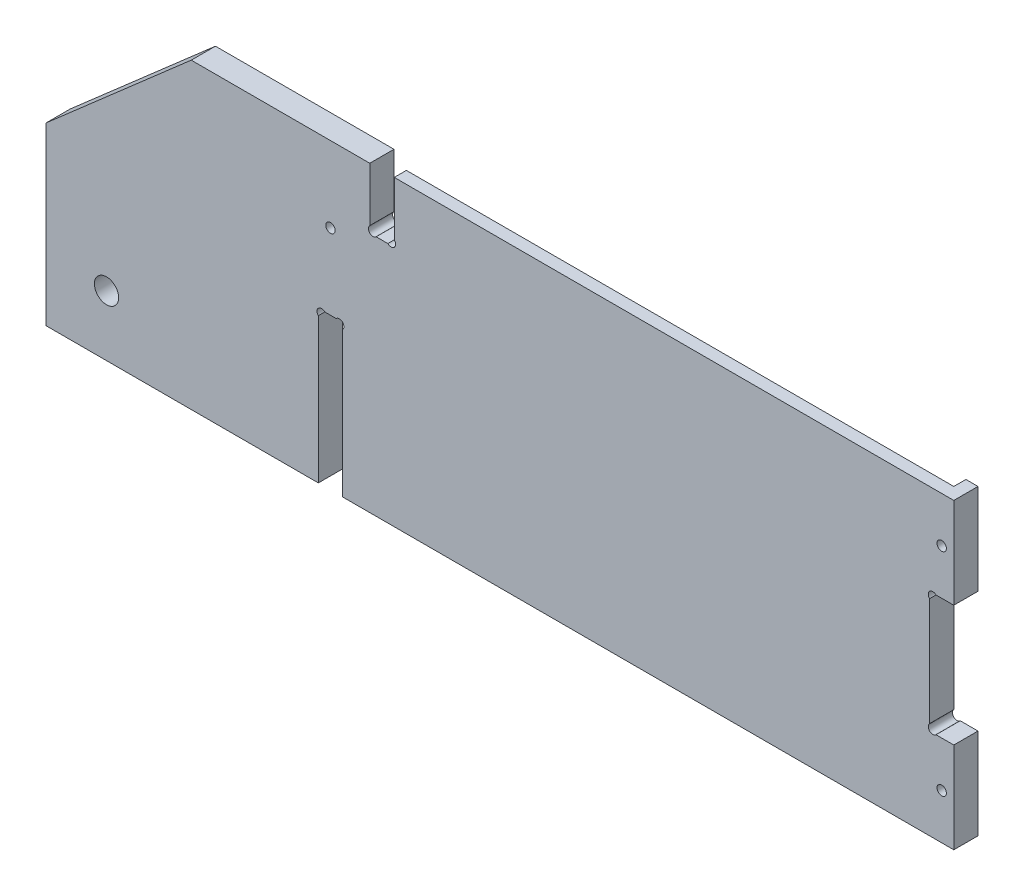
ISO-10303-21;
HEADER;
FILE_DESCRIPTION(('STEP AP214'),'2;1');
FILE_NAME('part.step','',(''),(''),'','','');
FILE_SCHEMA(('AUTOMOTIVE_DESIGN { 1 0 10303 214 1 1 1 1 }'));
ENDSEC;
DATA;
#1=APPLICATION_CONTEXT('core data for automotive mechanical design processes');
#2=APPLICATION_PROTOCOL_DEFINITION('international standard','automotive_design',2000,#1);
#3=PRODUCT_CONTEXT('',#1,'mechanical');
#4=PRODUCT('Part','Part','',(#3));
#5=PRODUCT_RELATED_PRODUCT_CATEGORY('part','',(#4));
#6=PRODUCT_DEFINITION_FORMATION('','',#4);
#7=PRODUCT_DEFINITION_CONTEXT('part definition',#1,'design');
#8=PRODUCT_DEFINITION('design','',#6,#7);
#9=PRODUCT_DEFINITION_SHAPE('','',#8);
#10=(LENGTH_UNIT() NAMED_UNIT(*) SI_UNIT(.MILLI.,.METRE.));
#11=(NAMED_UNIT(*) PLANE_ANGLE_UNIT() SI_UNIT($,.RADIAN.));
#12=(NAMED_UNIT(*) SI_UNIT($,.STERADIAN.) SOLID_ANGLE_UNIT());
#13=UNCERTAINTY_MEASURE_WITH_UNIT(LENGTH_MEASURE(1.E-05),#10,'distance_accuracy_value','');
#14=(GEOMETRIC_REPRESENTATION_CONTEXT(3) GLOBAL_UNCERTAINTY_ASSIGNED_CONTEXT((#13)) GLOBAL_UNIT_ASSIGNED_CONTEXT((#10,
#11,#12)) REPRESENTATION_CONTEXT('',''));
#15=CARTESIAN_POINT('',(0.,0.,0.));
#16=DIRECTION('',(0.,0.,1.));
#17=DIRECTION('',(1.,0.,0.));
#18=AXIS2_PLACEMENT_3D('',#15,#16,#17);
#19=CARTESIAN_POINT('',(46.9050399967534,13.4203251605363,8.));
#20=DIRECTION('',(0.,0.,1.));
#21=DIRECTION('',(1.,0.,0.));
#22=AXIS2_PLACEMENT_3D('',#19,#20,#21);
#23=PLANE('',#22);
#24=CARTESIAN_POINT('',(-30.0342998314668,-15.5190146676839,8.));
#25=DIRECTION('',(0.,0.,1.));
#26=DIRECTION('',(1.,0.,0.));
#27=AXIS2_PLACEMENT_3D('',#24,#25,#26);
#28=CIRCLE('',#27,4.);
#29=CARTESIAN_POINT('',(-26.0342998314668,-15.5190146676839,8.));
#30=VERTEX_POINT('',#29);
#31=EDGE_CURVE('E437',#30,#30,#28,.T.);
#32=ORIENTED_EDGE('',*,*,#31,.F.);
#33=EDGE_LOOP('',(#32));
#34=FACE_BOUND('',#33,.T.);
#35=CARTESIAN_POINT('',(245.965700168533,-20.5190146676839,8.));
#36=DIRECTION('',(0.,0.,1.));
#37=DIRECTION('',(1.,0.,0.));
#38=AXIS2_PLACEMENT_3D('',#35,#36,#37);
#39=CIRCLE('',#38,1.54999999999999);
#40=CARTESIAN_POINT('',(247.515700168533,-20.5190146676839,8.));
#41=VERTEX_POINT('',#40);
#42=EDGE_CURVE('E462',#41,#41,#39,.T.);
#43=ORIENTED_EDGE('',*,*,#42,.F.);
#44=EDGE_LOOP('',(#43));
#45=FACE_BOUND('',#44,.T.);
#46=DIRECTION('',(0.,1.,0.));
#47=VECTOR('',#46,1.);
#48=CARTESIAN_POINT('',(249.965700168533,-5.519014667684,8.));
#49=LINE('',#48,#47);
#50=CARTESIAN_POINT('',(249.965700168533,-35.5190146676839,8.));
#51=VERTEX_POINT('',#50);
#52=CARTESIAN_POINT('',(249.965700168533,-5.519014667684,8.));
#53=VERTEX_POINT('',#52);
#54=EDGE_CURVE('E275',#51,#53,#49,.T.);
#55=ORIENTED_EDGE('',*,*,#54,.T.);
#56=DIRECTION('',(-1.,0.,0.));
#57=VECTOR('',#56,1.);
#58=CARTESIAN_POINT('',(244.087020512093,-5.51901466768398,8.));
#59=LINE('',#58,#57);
#60=CARTESIAN_POINT('',(244.087020512093,-5.51901466768397,8.));
#61=VERTEX_POINT('',#60);
#62=EDGE_CURVE('E140',#53,#61,#59,.T.);
#63=ORIENTED_EDGE('',*,*,#62,.T.);
#64=CARTESIAN_POINT('',(243.026360340313,-4.45835449590417,8.));
#65=DIRECTION('',(0.,0.,-1.));
#66=DIRECTION('',(1.,0.,0.));
#67=AXIS2_PLACEMENT_3D('',#64,#65,#66);
#68=CIRCLE('',#67,1.50000000000001);
#69=CARTESIAN_POINT('',(241.965700168533,-3.39769432412416,8.));
#70=VERTEX_POINT('',#69);
#71=EDGE_CURVE('E403',#61,#70,#68,.T.);
#72=ORIENTED_EDGE('',*,*,#71,.T.);
#73=DIRECTION('',(0.,1.,0.));
#74=VECTOR('',#73,1.);
#75=CARTESIAN_POINT('',(241.965700168533,-3.39769432412416,8.));
#76=LINE('',#75,#74);
#77=CARTESIAN_POINT('',(241.965700168533,32.3596649887565,8.));
#78=VERTEX_POINT('',#77);
#79=EDGE_CURVE('E410',#70,#78,#76,.T.);
#80=ORIENTED_EDGE('',*,*,#79,.T.);
#81=CARTESIAN_POINT('',(243.026360340313,33.4203251605363,8.));
#82=DIRECTION('',(0.,0.,-1.));
#83=DIRECTION('',(1.,0.,0.));
#84=AXIS2_PLACEMENT_3D('',#81,#82,#83);
#85=CIRCLE('',#84,1.50000000000002);
#86=CARTESIAN_POINT('',(244.087020512093,34.4809853323162,8.));
#87=VERTEX_POINT('',#86);
#88=EDGE_CURVE('E412',#78,#87,#85,.T.);
#89=ORIENTED_EDGE('',*,*,#88,.T.);
#90=DIRECTION('',(1.,0.,0.));
#91=VECTOR('',#90,1.);
#92=CARTESIAN_POINT('',(244.087020512093,34.4809853323162,8.));
#93=LINE('',#92,#91);
#94=CARTESIAN_POINT('',(249.965700168533,34.4809853323162,8.));
#95=VERTEX_POINT('',#94);
#96=EDGE_CURVE('E414',#87,#95,#93,.T.);
#97=ORIENTED_EDGE('',*,*,#96,.T.);
#98=DIRECTION('',(0.,1.,0.));
#99=VECTOR('',#98,1.);
#100=CARTESIAN_POINT('',(249.965700168533,64.4809853323161,8.));
#101=LINE('',#100,#99);
#102=CARTESIAN_POINT('',(249.965700168533,64.4809853323161,8.));
#103=VERTEX_POINT('',#102);
#104=EDGE_CURVE('E363',#95,#103,#101,.T.);
#105=ORIENTED_EDGE('',*,*,#104,.T.);
#106=DIRECTION('',(-1.,0.,0.));
#107=VECTOR('',#106,1.);
#108=CARTESIAN_POINT('',(65.0567234642537,64.480985332316,8.));
#109=LINE('',#108,#107);
#110=CARTESIAN_POINT('',(65.0567234642537,64.480985332316,8.));
#111=VERTEX_POINT('',#110);
#112=EDGE_CURVE('E359',#103,#111,#109,.T.);
#113=ORIENTED_EDGE('',*,*,#112,.T.);
#114=DIRECTION('',(0.,-1.,0.));
#115=VECTOR('',#114,1.);
#116=CARTESIAN_POINT('',(65.0567234642537,46.6023056758756,8.));
#117=LINE('',#116,#115);
#118=CARTESIAN_POINT('',(65.0567234642537,46.6023056758756,8.));
#119=VERTEX_POINT('',#118);
#120=EDGE_CURVE('E356',#111,#119,#117,.T.);
#121=ORIENTED_EDGE('',*,*,#120,.T.);
#122=CARTESIAN_POINT('',(63.9960632924738,45.5416455040958,8.));
#123=DIRECTION('',(0.,0.,-1.));
#124=DIRECTION('',(1.,0.,0.));
#125=AXIS2_PLACEMENT_3D('',#122,#123,#124);
#126=CIRCLE('',#125,1.49999999999999);
#127=CARTESIAN_POINT('',(62.935403120694,44.480985332316,8.));
#128=VERTEX_POINT('',#127);
#129=EDGE_CURVE('E358',#119,#128,#126,.T.);
#130=ORIENTED_EDGE('',*,*,#129,.T.);
#131=DIRECTION('',(-1.,0.,0.));
#132=VECTOR('',#131,1.);
#133=CARTESIAN_POINT('',(62.935403120694,44.480985332316,8.));
#134=LINE('',#133,#132);
#135=CARTESIAN_POINT('',(59.0630231311127,44.480985332316,8.));
#136=VERTEX_POINT('',#135);
#137=EDGE_CURVE('E361',#128,#136,#134,.T.);
#138=ORIENTED_EDGE('',*,*,#137,.T.);
#139=CARTESIAN_POINT('',(58.014361649823,45.5535099696364,8.));
#140=DIRECTION('',(0.,0.,-1.));
#141=DIRECTION('',(1.,0.,0.));
#142=AXIS2_PLACEMENT_3D('',#139,#140,#141);
#143=CIRCLE('',#142,1.49999999999998);
#144=CARTESIAN_POINT('',(56.9657001685331,46.6260346069567,8.));
#145=VERTEX_POINT('',#144);
#146=EDGE_CURVE('E368',#136,#145,#143,.T.);
#147=ORIENTED_EDGE('',*,*,#146,.T.);
#148=DIRECTION('',(0.,1.,0.));
#149=VECTOR('',#148,1.);
#150=CARTESIAN_POINT('',(56.9657001685332,64.480985332316,8.));
#151=LINE('',#150,#149);
#152=CARTESIAN_POINT('',(56.9657001685332,64.480985332316,8.));
#153=VERTEX_POINT('',#152);
#154=EDGE_CURVE('E370',#145,#153,#151,.T.);
#155=ORIENTED_EDGE('',*,*,#154,.T.);
#156=DIRECTION('',(-1.,0.,0.));
#157=VECTOR('',#156,1.);
#158=CARTESIAN_POINT('',(-2.03429983146681,64.480985332316,8.));
#159=LINE('',#158,#157);
#160=CARTESIAN_POINT('',(-2.03429983146681,64.480985332316,8.));
#161=VERTEX_POINT('',#160);
#162=EDGE_CURVE('E372',#153,#161,#159,.T.);
#163=ORIENTED_EDGE('',*,*,#162,.T.);
#164=DIRECTION('',(-0.752824501912083,-0.658221292059763,0.));
#165=VECTOR('',#164,1.);
#166=CARTESIAN_POINT('',(-50.0342998314669,22.5128746523074,8.));
#167=LINE('',#166,#165);
#168=CARTESIAN_POINT('',(-50.0342998314669,22.5128746523074,8.));
#169=VERTEX_POINT('',#168);
#170=EDGE_CURVE('E374',#161,#169,#167,.T.);
#171=ORIENTED_EDGE('',*,*,#170,.T.);
#172=DIRECTION('',(0.,-1.,0.));
#173=VECTOR('',#172,1.);
#174=CARTESIAN_POINT('',(-50.0342998314669,22.5128746523074,8.));
#175=LINE('',#174,#173);
#176=CARTESIAN_POINT('',(-50.0342998314668,-35.5190146676839,8.));
#177=VERTEX_POINT('',#176);
#178=EDGE_CURVE('E376',#169,#177,#175,.T.);
#179=ORIENTED_EDGE('',*,*,#178,.T.);
#180=DIRECTION('',(1.,0.,0.));
#181=VECTOR('',#180,1.);
#182=CARTESIAN_POINT('',(-50.0342998314668,-35.5190146676839,8.));
#183=LINE('',#182,#181);
#184=CARTESIAN_POINT('',(39.9657001685332,-35.5190146676839,8.));
#185=VERTEX_POINT('',#184);
#186=EDGE_CURVE('E378',#177,#185,#183,.T.);
#187=ORIENTED_EDGE('',*,*,#186,.T.);
#188=DIRECTION('',(0.,1.,0.));
#189=VECTOR('',#188,1.);
#190=CARTESIAN_POINT('',(39.9657001685332,-35.5190146676839,8.));
#191=LINE('',#190,#189);
#192=CARTESIAN_POINT('',(39.9657001685332,12.3596649887565,8.));
#193=VERTEX_POINT('',#192);
#194=EDGE_CURVE('E380',#185,#193,#191,.T.);
#195=ORIENTED_EDGE('',*,*,#194,.T.);
#196=CARTESIAN_POINT('',(41.0263603403129,13.4203251605363,8.));
#197=DIRECTION('',(0.,0.,-1.));
#198=DIRECTION('',(1.,0.,0.));
#199=AXIS2_PLACEMENT_3D('',#196,#197,#198);
#200=CIRCLE('',#199,1.5);
#201=CARTESIAN_POINT('',(42.0870205120928,14.4809853323161,8.));
#202=VERTEX_POINT('',#201);
#203=EDGE_CURVE('E382',#193,#202,#200,.T.);
#204=ORIENTED_EDGE('',*,*,#203,.T.);
#205=DIRECTION('',(1.,0.,0.));
#206=VECTOR('',#205,1.);
#207=CARTESIAN_POINT('',(42.0870205120928,14.4809853323161,8.));
#208=LINE('',#207,#206);
#209=CARTESIAN_POINT('',(45.8443798249735,14.4809853323161,8.));
#210=VERTEX_POINT('',#209);
#211=EDGE_CURVE('E207',#202,#210,#208,.T.);
#212=ORIENTED_EDGE('',*,*,#211,.T.);
#213=CARTESIAN_POINT('',(46.9050399967534,13.4203251605363,8.));
#214=DIRECTION('',(0.,0.,-1.));
#215=DIRECTION('',(1.,0.,0.));
#216=AXIS2_PLACEMENT_3D('',#213,#214,#215);
#217=CIRCLE('',#216,1.50000000000001);
#218=CARTESIAN_POINT('',(47.9657001685333,12.3596649887566,8.));
#219=VERTEX_POINT('',#218);
#220=EDGE_CURVE('E200',#210,#219,#217,.T.);
#221=ORIENTED_EDGE('',*,*,#220,.T.);
#222=DIRECTION('',(0.,-1.,0.));
#223=VECTOR('',#222,1.);
#224=CARTESIAN_POINT('',(47.9657001685333,-35.5190146676839,8.));
#225=LINE('',#224,#223);
#226=CARTESIAN_POINT('',(47.9657001685333,-35.5190146676839,8.));
#227=VERTEX_POINT('',#226);
#228=EDGE_CURVE('E204',#219,#227,#225,.T.);
#229=ORIENTED_EDGE('',*,*,#228,.T.);
#230=DIRECTION('',(1.,0.,0.));
#231=VECTOR('',#230,1.);
#232=CARTESIAN_POINT('',(47.9657001685333,-35.5190146676839,8.));
#233=LINE('',#232,#231);
#234=EDGE_CURVE('E56',#227,#51,#233,.T.);
#235=ORIENTED_EDGE('',*,*,#234,.T.);
#236=EDGE_LOOP('',(#55,#63,#72,#80,#89,#97,#105,#113,#121,#130,#138,#147,#155,#163,#171,#179,
#187,#195,#204,#212,#221,#229,#235));
#237=FACE_BOUND('',#236,.T.);
#238=CARTESIAN_POINT('',(245.965700168533,49.4809853323161,8.));
#239=DIRECTION('',(0.,0.,1.));
#240=DIRECTION('',(1.,0.,0.));
#241=AXIS2_PLACEMENT_3D('',#238,#239,#240);
#242=CIRCLE('',#241,1.54999999999999);
#243=CARTESIAN_POINT('',(247.515700168533,49.4809853323161,8.));
#244=VERTEX_POINT('',#243);
#245=EDGE_CURVE('E232',#244,#244,#242,.T.);
#246=ORIENTED_EDGE('',*,*,#245,.F.);
#247=EDGE_LOOP('',(#246));
#248=FACE_BOUND('',#247,.T.);
#249=CARTESIAN_POINT('',(43.9657001685332,39.4809853323161,8.));
#250=DIRECTION('',(0.,0.,1.));
#251=DIRECTION('',(1.,0.,0.));
#252=AXIS2_PLACEMENT_3D('',#249,#250,#251);
#253=CIRCLE('',#252,1.55);
#254=CARTESIAN_POINT('',(45.5157001685332,39.4809853323161,8.));
#255=VERTEX_POINT('',#254);
#256=EDGE_CURVE('E456',#255,#255,#253,.T.);
#257=ORIENTED_EDGE('',*,*,#256,.F.);
#258=EDGE_LOOP('',(#257));
#259=FACE_BOUND('',#258,.T.);
#260=ADVANCED_FACE('F32',(#34,#45,#237,#248,#259),#23,.T.);
#261=CARTESIAN_POINT('',(46.9050399967534,13.4203251605363,0.));
#262=DIRECTION('',(0.,0.,1.));
#263=DIRECTION('',(1.,0.,0.));
#264=AXIS2_PLACEMENT_3D('',#261,#262,#263);
#265=PLANE('',#264);
#266=CARTESIAN_POINT('',(-30.0342998314668,-15.5190146676839,0.));
#267=DIRECTION('',(0.,0.,-1.));
#268=DIRECTION('',(-1.,0.,0.));
#269=AXIS2_PLACEMENT_3D('',#266,#267,#268);
#270=CIRCLE('',#269,4.);
#271=CARTESIAN_POINT('',(-34.0342998314669,-15.5190146676839,0.));
#272=VERTEX_POINT('',#271);
#273=EDGE_CURVE('E442',#272,#272,#270,.T.);
#274=ORIENTED_EDGE('',*,*,#273,.F.);
#275=EDGE_LOOP('',(#274));
#276=FACE_BOUND('',#275,.T.);
#277=CARTESIAN_POINT('',(245.965700168533,-20.5190146676839,0.));
#278=DIRECTION('',(0.,0.,1.));
#279=DIRECTION('',(1.,0.,0.));
#280=AXIS2_PLACEMENT_3D('',#277,#278,#279);
#281=CIRCLE('',#280,1.54999999999999);
#282=CARTESIAN_POINT('',(247.515700168533,-20.5190146676839,0.));
#283=VERTEX_POINT('',#282);
#284=EDGE_CURVE('E459',#283,#283,#281,.T.);
#285=ORIENTED_EDGE('',*,*,#284,.T.);
#286=EDGE_LOOP('',(#285));
#287=FACE_BOUND('',#286,.T.);
#288=CARTESIAN_POINT('',(244.905039996753,53.5416455040959,0.));
#289=DIRECTION('',(0.,0.,-1.));
#290=DIRECTION('',(-1.,0.,0.));
#291=AXIS2_PLACEMENT_3D('',#288,#289,#290);
#292=CIRCLE('',#291,1.5);
#293=CARTESIAN_POINT('',(245.965700168533,54.6023056758757,0.));
#294=VERTEX_POINT('',#293);
#295=CARTESIAN_POINT('',(243.844379824974,52.480985332316,0.));
#296=VERTEX_POINT('',#295);
#297=EDGE_CURVE('E431',#294,#296,#292,.T.);
#298=ORIENTED_EDGE('',*,*,#297,.F.);
#299=DIRECTION('',(0.,-1.,0.));
#300=VECTOR('',#299,1.);
#301=CARTESIAN_POINT('',(245.965700168533,64.480985332316,0.));
#302=LINE('',#301,#300);
#303=CARTESIAN_POINT('',(245.965700168533,64.480985332316,0.));
#304=VERTEX_POINT('',#303);
#305=EDGE_CURVE('E427',#304,#294,#302,.T.);
#306=ORIENTED_EDGE('',*,*,#305,.F.);
#307=DIRECTION('',(-1.,0.,0.));
#308=VECTOR('',#307,1.);
#309=CARTESIAN_POINT('',(65.0567234642537,64.480985332316,0.));
#310=LINE('',#309,#308);
#311=CARTESIAN_POINT('',(249.965700168533,64.4809853323161,0.));
#312=VERTEX_POINT('',#311);
#313=EDGE_CURVE('E244',#312,#304,#310,.T.);
#314=ORIENTED_EDGE('',*,*,#313,.F.);
#315=DIRECTION('',(0.,1.,0.));
#316=VECTOR('',#315,1.);
#317=CARTESIAN_POINT('',(249.965700168533,64.4809853323161,0.));
#318=LINE('',#317,#316);
#319=CARTESIAN_POINT('',(249.965700168533,34.4809853323162,0.));
#320=VERTEX_POINT('',#319);
#321=EDGE_CURVE('E242',#320,#312,#318,.T.);
#322=ORIENTED_EDGE('',*,*,#321,.F.);
#323=DIRECTION('',(1.,0.,0.));
#324=VECTOR('',#323,1.);
#325=CARTESIAN_POINT('',(244.087020512093,34.4809853323162,0.));
#326=LINE('',#325,#324);
#327=CARTESIAN_POINT('',(244.087020512093,34.4809853323162,0.));
#328=VERTEX_POINT('',#327);
#329=EDGE_CURVE('E240',#328,#320,#326,.T.);
#330=ORIENTED_EDGE('',*,*,#329,.F.);
#331=CARTESIAN_POINT('',(243.026360340313,33.4203251605363,0.));
#332=DIRECTION('',(0.,0.,-1.));
#333=DIRECTION('',(1.,0.,0.));
#334=AXIS2_PLACEMENT_3D('',#331,#332,#333);
#335=CIRCLE('',#334,1.50000000000002);
#336=CARTESIAN_POINT('',(241.965700168533,32.3596649887565,0.));
#337=VERTEX_POINT('',#336);
#338=EDGE_CURVE('E238',#337,#328,#335,.T.);
#339=ORIENTED_EDGE('',*,*,#338,.F.);
#340=DIRECTION('',(0.,1.,0.));
#341=VECTOR('',#340,1.);
#342=CARTESIAN_POINT('',(241.965700168533,-3.39769432412416,0.));
#343=LINE('',#342,#341);
#344=CARTESIAN_POINT('',(241.965700168533,-3.39769432412416,0.));
#345=VERTEX_POINT('',#344);
#346=EDGE_CURVE('E236',#345,#337,#343,.T.);
#347=ORIENTED_EDGE('',*,*,#346,.F.);
#348=CARTESIAN_POINT('',(243.026360340313,-4.45835449590417,0.));
#349=DIRECTION('',(0.,0.,-1.));
#350=DIRECTION('',(1.,0.,0.));
#351=AXIS2_PLACEMENT_3D('',#348,#349,#350);
#352=CIRCLE('',#351,1.50000000000001);
#353=CARTESIAN_POINT('',(244.087020512093,-5.51901466768397,0.));
#354=VERTEX_POINT('',#353);
#355=EDGE_CURVE('E234',#354,#345,#352,.T.);
#356=ORIENTED_EDGE('',*,*,#355,.F.);
#357=DIRECTION('',(-1.,0.,0.));
#358=VECTOR('',#357,1.);
#359=CARTESIAN_POINT('',(244.087020512093,-5.51901466768398,0.));
#360=LINE('',#359,#358);
#361=CARTESIAN_POINT('',(249.965700168533,-5.519014667684,0.));
#362=VERTEX_POINT('',#361);
#363=EDGE_CURVE('E231',#362,#354,#360,.T.);
#364=ORIENTED_EDGE('',*,*,#363,.F.);
#365=DIRECTION('',(0.,1.,0.));
#366=VECTOR('',#365,1.);
#367=CARTESIAN_POINT('',(249.965700168533,-5.519014667684,0.));
#368=LINE('',#367,#366);
#369=CARTESIAN_POINT('',(249.965700168533,-35.5190146676839,0.));
#370=VERTEX_POINT('',#369);
#371=EDGE_CURVE('E228',#370,#362,#368,.T.);
#372=ORIENTED_EDGE('',*,*,#371,.F.);
#373=DIRECTION('',(1.,0.,0.));
#374=VECTOR('',#373,1.);
#375=CARTESIAN_POINT('',(47.9657001685333,-35.5190146676839,0.));
#376=LINE('',#375,#374);
#377=CARTESIAN_POINT('',(47.9657001685333,-35.5190146676839,0.));
#378=VERTEX_POINT('',#377);
#379=EDGE_CURVE('E131',#378,#370,#376,.T.);
#380=ORIENTED_EDGE('',*,*,#379,.F.);
#381=DIRECTION('',(0.,-1.,0.));
#382=VECTOR('',#381,1.);
#383=CARTESIAN_POINT('',(47.9657001685333,-35.5190146676839,0.));
#384=LINE('',#383,#382);
#385=CARTESIAN_POINT('',(47.9657001685333,12.3596649887566,0.));
#386=VERTEX_POINT('',#385);
#387=EDGE_CURVE('E272',#386,#378,#384,.T.);
#388=ORIENTED_EDGE('',*,*,#387,.F.);
#389=CARTESIAN_POINT('',(46.9050399967534,13.4203251605363,0.));
#390=DIRECTION('',(0.,0.,-1.));
#391=DIRECTION('',(1.,0.,0.));
#392=AXIS2_PLACEMENT_3D('',#389,#390,#391);
#393=CIRCLE('',#392,1.50000000000001);
#394=CARTESIAN_POINT('',(45.8443798249735,14.4809853323161,0.));
#395=VERTEX_POINT('',#394);
#396=EDGE_CURVE('E216',#395,#386,#393,.T.);
#397=ORIENTED_EDGE('',*,*,#396,.F.);
#398=DIRECTION('',(1.,0.,0.));
#399=VECTOR('',#398,1.);
#400=CARTESIAN_POINT('',(42.0870205120928,14.4809853323161,0.));
#401=LINE('',#400,#399);
#402=CARTESIAN_POINT('',(42.0870205120928,14.4809853323161,0.));
#403=VERTEX_POINT('',#402);
#404=EDGE_CURVE('E269',#403,#395,#401,.T.);
#405=ORIENTED_EDGE('',*,*,#404,.F.);
#406=CARTESIAN_POINT('',(41.0263603403129,13.4203251605363,0.));
#407=DIRECTION('',(0.,0.,-1.));
#408=DIRECTION('',(1.,0.,0.));
#409=AXIS2_PLACEMENT_3D('',#406,#407,#408);
#410=CIRCLE('',#409,1.5);
#411=CARTESIAN_POINT('',(39.9657001685332,12.3596649887565,0.));
#412=VERTEX_POINT('',#411);
#413=EDGE_CURVE('E267',#412,#403,#410,.T.);
#414=ORIENTED_EDGE('',*,*,#413,.F.);
#415=DIRECTION('',(0.,1.,0.));
#416=VECTOR('',#415,1.);
#417=CARTESIAN_POINT('',(39.9657001685332,-35.5190146676839,0.));
#418=LINE('',#417,#416);
#419=CARTESIAN_POINT('',(39.9657001685332,-35.5190146676839,0.));
#420=VERTEX_POINT('',#419);
#421=EDGE_CURVE('E265',#420,#412,#418,.T.);
#422=ORIENTED_EDGE('',*,*,#421,.F.);
#423=DIRECTION('',(1.,0.,0.));
#424=VECTOR('',#423,1.);
#425=CARTESIAN_POINT('',(-50.0342998314668,-35.5190146676839,0.));
#426=LINE('',#425,#424);
#427=CARTESIAN_POINT('',(-50.0342998314668,-35.5190146676839,0.));
#428=VERTEX_POINT('',#427);
#429=EDGE_CURVE('E263',#428,#420,#426,.T.);
#430=ORIENTED_EDGE('',*,*,#429,.F.);
#431=DIRECTION('',(0.,-1.,0.));
#432=VECTOR('',#431,1.);
#433=CARTESIAN_POINT('',(-50.0342998314669,22.5128746523074,0.));
#434=LINE('',#433,#432);
#435=CARTESIAN_POINT('',(-50.0342998314669,22.5128746523074,0.));
#436=VERTEX_POINT('',#435);
#437=EDGE_CURVE('E261',#436,#428,#434,.T.);
#438=ORIENTED_EDGE('',*,*,#437,.F.);
#439=DIRECTION('',(-0.752824501912083,-0.658221292059763,0.));
#440=VECTOR('',#439,1.);
#441=CARTESIAN_POINT('',(-50.0342998314669,22.5128746523074,0.));
#442=LINE('',#441,#440);
#443=CARTESIAN_POINT('',(-2.03429983146681,64.480985332316,0.));
#444=VERTEX_POINT('',#443);
#445=EDGE_CURVE('E259',#444,#436,#442,.T.);
#446=ORIENTED_EDGE('',*,*,#445,.F.);
#447=DIRECTION('',(-1.,0.,0.));
#448=VECTOR('',#447,1.);
#449=CARTESIAN_POINT('',(-2.03429983146681,64.480985332316,0.));
#450=LINE('',#449,#448);
#451=CARTESIAN_POINT('',(56.9657001685332,64.480985332316,0.));
#452=VERTEX_POINT('',#451);
#453=EDGE_CURVE('E257',#452,#444,#450,.T.);
#454=ORIENTED_EDGE('',*,*,#453,.F.);
#455=DIRECTION('',(0.,1.,0.));
#456=VECTOR('',#455,1.);
#457=CARTESIAN_POINT('',(56.9657001685332,64.480985332316,0.));
#458=LINE('',#457,#456);
#459=CARTESIAN_POINT('',(56.9657001685331,46.6260346069567,0.));
#460=VERTEX_POINT('',#459);
#461=EDGE_CURVE('E255',#460,#452,#458,.T.);
#462=ORIENTED_EDGE('',*,*,#461,.F.);
#463=CARTESIAN_POINT('',(58.014361649823,45.5535099696364,0.));
#464=DIRECTION('',(0.,0.,-1.));
#465=DIRECTION('',(1.,0.,0.));
#466=AXIS2_PLACEMENT_3D('',#463,#464,#465);
#467=CIRCLE('',#466,1.49999999999998);
#468=CARTESIAN_POINT('',(59.0630231311127,44.480985332316,0.));
#469=VERTEX_POINT('',#468);
#470=EDGE_CURVE('E253',#469,#460,#467,.T.);
#471=ORIENTED_EDGE('',*,*,#470,.F.);
#472=DIRECTION('',(-1.,0.,0.));
#473=VECTOR('',#472,1.);
#474=CARTESIAN_POINT('',(62.935403120694,44.480985332316,0.));
#475=LINE('',#474,#473);
#476=CARTESIAN_POINT('',(62.935403120694,44.480985332316,0.));
#477=VERTEX_POINT('',#476);
#478=EDGE_CURVE('E251',#477,#469,#475,.T.);
#479=ORIENTED_EDGE('',*,*,#478,.F.);
#480=CARTESIAN_POINT('',(63.9960632924738,45.5416455040958,0.));
#481=DIRECTION('',(0.,0.,-1.));
#482=DIRECTION('',(1.,0.,0.));
#483=AXIS2_PLACEMENT_3D('',#480,#481,#482);
#484=CIRCLE('',#483,1.49999999999999);
#485=CARTESIAN_POINT('',(65.0567234642537,46.6023056758756,0.));
#486=VERTEX_POINT('',#485);
#487=EDGE_CURVE('E249',#486,#477,#484,.T.);
#488=ORIENTED_EDGE('',*,*,#487,.F.);
#489=DIRECTION('',(0.,-1.,0.));
#490=VECTOR('',#489,1.);
#491=CARTESIAN_POINT('',(65.0567234642537,46.6023056758756,0.));
#492=LINE('',#491,#490);
#493=CARTESIAN_POINT('',(65.0567234642537,52.480985332316,0.));
#494=VERTEX_POINT('',#493);
#495=EDGE_CURVE('E247',#494,#486,#492,.T.);
#496=ORIENTED_EDGE('',*,*,#495,.F.);
#497=DIRECTION('',(-1.,0.,0.));
#498=VECTOR('',#497,1.);
#499=CARTESIAN_POINT('',(243.844379824974,52.480985332316,0.));
#500=LINE('',#499,#498);
#501=EDGE_CURVE('E439',#296,#494,#500,.T.);
#502=ORIENTED_EDGE('',*,*,#501,.F.);
#503=EDGE_LOOP('',(#298,#306,#314,#322,#330,#339,#347,#356,#364,#372,#380,#388,#397,#405,#414,
#422,#430,#438,#446,#454,#462,#471,#479,#488,#496,#502));
#504=FACE_BOUND('',#503,.T.);
#505=CARTESIAN_POINT('',(245.965700168533,49.4809853323161,0.));
#506=DIRECTION('',(0.,0.,1.));
#507=DIRECTION('',(1.,0.,0.));
#508=AXIS2_PLACEMENT_3D('',#505,#506,#507);
#509=CIRCLE('',#508,1.54999999999999);
#510=CARTESIAN_POINT('',(247.515700168533,49.4809853323161,0.));
#511=VERTEX_POINT('',#510);
#512=EDGE_CURVE('E406',#511,#511,#509,.T.);
#513=ORIENTED_EDGE('',*,*,#512,.T.);
#514=EDGE_LOOP('',(#513));
#515=FACE_BOUND('',#514,.T.);
#516=CARTESIAN_POINT('',(43.9657001685332,39.4809853323161,0.));
#517=DIRECTION('',(0.,0.,1.));
#518=DIRECTION('',(1.,0.,0.));
#519=AXIS2_PLACEMENT_3D('',#516,#517,#518);
#520=CIRCLE('',#519,1.55);
#521=CARTESIAN_POINT('',(45.5157001685332,39.4809853323161,0.));
#522=VERTEX_POINT('',#521);
#523=EDGE_CURVE('E450',#522,#522,#520,.T.);
#524=ORIENTED_EDGE('',*,*,#523,.T.);
#525=EDGE_LOOP('',(#524));
#526=FACE_BOUND('',#525,.T.);
#527=ADVANCED_FACE('F395',(#276,#287,#504,#515,#526),#265,.F.);
#528=CARTESIAN_POINT('',(249.965700168533,-5.519014667684,8.));
#529=DIRECTION('',(-1.,0.,0.));
#530=DIRECTION('',(0.,-1.,0.));
#531=AXIS2_PLACEMENT_3D('',#528,#529,#530);
#532=PLANE('',#531);
#533=ORIENTED_EDGE('',*,*,#371,.T.);
#534=DIRECTION('',(0.,0.,-1.));
#535=VECTOR('',#534,1.);
#536=CARTESIAN_POINT('',(249.965700168533,-5.519014667684,8.));
#537=LINE('',#536,#535);
#538=EDGE_CURVE('E333',#53,#362,#537,.T.);
#539=ORIENTED_EDGE('',*,*,#538,.F.);
#540=ORIENTED_EDGE('',*,*,#54,.F.);
#541=DIRECTION('',(0.,0.,-1.));
#542=VECTOR('',#541,1.);
#543=CARTESIAN_POINT('',(249.965700168533,-35.5190146676839,8.));
#544=LINE('',#543,#542);
#545=EDGE_CURVE('E224',#51,#370,#544,.T.);
#546=ORIENTED_EDGE('',*,*,#545,.T.);
#547=EDGE_LOOP('',(#533,#539,#540,#546));
#548=FACE_BOUND('',#547,.T.);
#549=ADVANCED_FACE('F34',(#548),#532,.F.);
#550=CARTESIAN_POINT('',(244.087020512093,-5.51901466768398,8.));
#551=DIRECTION('',(0.,-1.,0.));
#552=DIRECTION('',(1.,0.,0.));
#553=AXIS2_PLACEMENT_3D('',#550,#551,#552);
#554=PLANE('',#553);
#555=ORIENTED_EDGE('',*,*,#363,.T.);
#556=DIRECTION('',(0.,0.,-1.));
#557=VECTOR('',#556,1.);
#558=CARTESIAN_POINT('',(244.087020512093,-5.51901466768397,8.));
#559=LINE('',#558,#557);
#560=EDGE_CURVE('E330',#61,#354,#559,.T.);
#561=ORIENTED_EDGE('',*,*,#560,.F.);
#562=ORIENTED_EDGE('',*,*,#62,.F.);
#563=ORIENTED_EDGE('',*,*,#538,.T.);
#564=EDGE_LOOP('',(#555,#561,#562,#563));
#565=FACE_BOUND('',#564,.T.);
#566=ADVANCED_FACE('F560',(#565),#554,.F.);
#567=CARTESIAN_POINT('',(243.026360340313,-4.45835449590417,8.));
#568=DIRECTION('',(0.,0.,-1.));
#569=DIRECTION('',(-1.,0.,0.));
#570=AXIS2_PLACEMENT_3D('',#567,#568,#569);
#571=CYLINDRICAL_SURFACE('',#570,1.50000000000001);
#572=ORIENTED_EDGE('',*,*,#355,.T.);
#573=DIRECTION('',(0.,0.,-1.));
#574=VECTOR('',#573,1.);
#575=CARTESIAN_POINT('',(241.965700168533,-3.39769432412416,8.));
#576=LINE('',#575,#574);
#577=EDGE_CURVE('E327',#70,#345,#576,.T.);
#578=ORIENTED_EDGE('',*,*,#577,.F.);
#579=ORIENTED_EDGE('',*,*,#71,.F.);
#580=ORIENTED_EDGE('',*,*,#560,.T.);
#581=EDGE_LOOP('',(#572,#578,#579,#580));
#582=FACE_BOUND('',#581,.T.);
#583=ADVANCED_FACE('F557',(#582),#571,.F.);
#584=CARTESIAN_POINT('',(241.965700168533,-3.39769432412416,8.));
#585=DIRECTION('',(-1.,0.,0.));
#586=DIRECTION('',(0.,0.,1.));
#587=AXIS2_PLACEMENT_3D('',#584,#585,#586);
#588=PLANE('',#587);
#589=ORIENTED_EDGE('',*,*,#346,.T.);
#590=DIRECTION('',(0.,0.,-1.));
#591=VECTOR('',#590,1.);
#592=CARTESIAN_POINT('',(241.965700168533,32.3596649887565,8.));
#593=LINE('',#592,#591);
#594=EDGE_CURVE('E324',#78,#337,#593,.T.);
#595=ORIENTED_EDGE('',*,*,#594,.F.);
#596=ORIENTED_EDGE('',*,*,#79,.F.);
#597=ORIENTED_EDGE('',*,*,#577,.T.);
#598=EDGE_LOOP('',(#589,#595,#596,#597));
#599=FACE_BOUND('',#598,.T.);
#600=ADVANCED_FACE('F553',(#599),#588,.F.);
#601=CARTESIAN_POINT('',(243.026360340313,33.4203251605363,8.));
#602=DIRECTION('',(0.,0.,-1.));
#603=DIRECTION('',(-1.,0.,0.));
#604=AXIS2_PLACEMENT_3D('',#601,#602,#603);
#605=CYLINDRICAL_SURFACE('',#604,1.50000000000002);
#606=ORIENTED_EDGE('',*,*,#338,.T.);
#607=DIRECTION('',(0.,0.,-1.));
#608=VECTOR('',#607,1.);
#609=CARTESIAN_POINT('',(244.087020512093,34.4809853323162,8.));
#610=LINE('',#609,#608);
#611=EDGE_CURVE('E321',#87,#328,#610,.T.);
#612=ORIENTED_EDGE('',*,*,#611,.F.);
#613=ORIENTED_EDGE('',*,*,#88,.F.);
#614=ORIENTED_EDGE('',*,*,#594,.T.);
#615=EDGE_LOOP('',(#606,#612,#613,#614));
#616=FACE_BOUND('',#615,.T.);
#617=ADVANCED_FACE('F549',(#616),#605,.F.);
#618=CARTESIAN_POINT('',(244.087020512093,34.4809853323162,8.));
#619=DIRECTION('',(0.,1.,0.));
#620=DIRECTION('',(0.,0.,1.));
#621=AXIS2_PLACEMENT_3D('',#618,#619,#620);
#622=PLANE('',#621);
#623=ORIENTED_EDGE('',*,*,#329,.T.);
#624=DIRECTION('',(0.,0.,-1.));
#625=VECTOR('',#624,1.);
#626=CARTESIAN_POINT('',(249.965700168533,34.4809853323162,8.));
#627=LINE('',#626,#625);
#628=EDGE_CURVE('E318',#95,#320,#627,.T.);
#629=ORIENTED_EDGE('',*,*,#628,.F.);
#630=ORIENTED_EDGE('',*,*,#96,.F.);
#631=ORIENTED_EDGE('',*,*,#611,.T.);
#632=EDGE_LOOP('',(#623,#629,#630,#631));
#633=FACE_BOUND('',#632,.T.);
#634=ADVANCED_FACE('F546',(#633),#622,.F.);
#635=CARTESIAN_POINT('',(249.965700168533,64.4809853323161,8.));
#636=DIRECTION('',(-1.,0.,0.));
#637=DIRECTION('',(0.,0.,1.));
#638=AXIS2_PLACEMENT_3D('',#635,#636,#637);
#639=PLANE('',#638);
#640=ORIENTED_EDGE('',*,*,#321,.T.);
#641=DIRECTION('',(0.,0.,-1.));
#642=VECTOR('',#641,1.);
#643=CARTESIAN_POINT('',(249.965700168533,64.4809853323161,8.));
#644=LINE('',#643,#642);
#645=EDGE_CURVE('E315',#103,#312,#644,.T.);
#646=ORIENTED_EDGE('',*,*,#645,.F.);
#647=ORIENTED_EDGE('',*,*,#104,.F.);
#648=ORIENTED_EDGE('',*,*,#628,.T.);
#649=EDGE_LOOP('',(#640,#646,#647,#648));
#650=FACE_BOUND('',#649,.T.);
#651=ADVANCED_FACE('F420',(#650),#639,.F.);
#652=CARTESIAN_POINT('',(65.0567234642537,64.480985332316,8.));
#653=DIRECTION('',(0.,-1.,0.));
#654=DIRECTION('',(1.,0.,0.));
#655=AXIS2_PLACEMENT_3D('',#652,#653,#654);
#656=PLANE('',#655);
#657=ORIENTED_EDGE('',*,*,#313,.T.);
#658=DIRECTION('',(0.,0.,-1.));
#659=VECTOR('',#658,1.);
#660=CARTESIAN_POINT('',(245.965700168533,64.480985332316,4.));
#661=LINE('',#660,#659);
#662=CARTESIAN_POINT('',(245.965700168533,64.480985332316,4.));
#663=VERTEX_POINT('',#662);
#664=EDGE_CURVE('E351',#663,#304,#661,.T.);
#665=ORIENTED_EDGE('',*,*,#664,.F.);
#666=DIRECTION('',(1.,0.,0.));
#667=VECTOR('',#666,1.);
#668=CARTESIAN_POINT('',(245.965700168533,64.480985332316,4.));
#669=LINE('',#668,#667);
#670=CARTESIAN_POINT('',(65.0567234642537,64.480985332316,4.));
#671=VERTEX_POINT('',#670);
#672=EDGE_CURVE('E340',#671,#663,#669,.T.);
#673=ORIENTED_EDGE('',*,*,#672,.F.);
#674=DIRECTION('',(0.,0.,-1.));
#675=VECTOR('',#674,1.);
#676=CARTESIAN_POINT('',(65.0567234642537,64.480985332316,8.));
#677=LINE('',#676,#675);
#678=EDGE_CURVE('E312',#111,#671,#677,.T.);
#679=ORIENTED_EDGE('',*,*,#678,.F.);
#680=ORIENTED_EDGE('',*,*,#112,.F.);
#681=ORIENTED_EDGE('',*,*,#645,.T.);
#682=EDGE_LOOP('',(#657,#665,#673,#679,#680,#681));
#683=FACE_BOUND('',#682,.T.);
#684=ADVANCED_FACE('F347',(#683),#656,.F.);
#685=CARTESIAN_POINT('',(65.0567234642537,46.6023056758756,8.));
#686=DIRECTION('',(1.,0.,0.));
#687=DIRECTION('',(0.,1.,0.));
#688=AXIS2_PLACEMENT_3D('',#685,#686,#687);
#689=PLANE('',#688);
#690=DIRECTION('',(0.,1.,0.));
#691=VECTOR('',#690,1.);
#692=CARTESIAN_POINT('',(65.0567234642537,46.6023056758756,4.));
#693=LINE('',#692,#691);
#694=CARTESIAN_POINT('',(65.0567234642537,52.480985332316,4.));
#695=VERTEX_POINT('',#694);
#696=EDGE_CURVE('E40',#695,#671,#693,.T.);
#697=ORIENTED_EDGE('',*,*,#696,.F.);
#698=DIRECTION('',(0.,0.,-1.));
#699=VECTOR('',#698,1.);
#700=CARTESIAN_POINT('',(65.0567234642537,52.480985332316,8.));
#701=LINE('',#700,#699);
#702=EDGE_CURVE('E11',#695,#494,#701,.T.);
#703=ORIENTED_EDGE('',*,*,#702,.T.);
#704=ORIENTED_EDGE('',*,*,#495,.T.);
#705=DIRECTION('',(0.,0.,-1.));
#706=VECTOR('',#705,1.);
#707=CARTESIAN_POINT('',(65.0567234642537,46.6023056758756,8.));
#708=LINE('',#707,#706);
#709=EDGE_CURVE('E309',#119,#486,#708,.T.);
#710=ORIENTED_EDGE('',*,*,#709,.F.);
#711=ORIENTED_EDGE('',*,*,#120,.F.);
#712=ORIENTED_EDGE('',*,*,#678,.T.);
#713=EDGE_LOOP('',(#697,#703,#704,#710,#711,#712));
#714=FACE_BOUND('',#713,.T.);
#715=ADVANCED_FACE('F354',(#714),#689,.F.);
#716=CARTESIAN_POINT('',(63.9960632924738,45.5416455040958,8.));
#717=DIRECTION('',(0.,0.,-1.));
#718=DIRECTION('',(-1.,0.,0.));
#719=AXIS2_PLACEMENT_3D('',#716,#717,#718);
#720=CYLINDRICAL_SURFACE('',#719,1.49999999999999);
#721=ORIENTED_EDGE('',*,*,#487,.T.);
#722=DIRECTION('',(0.,0.,-1.));
#723=VECTOR('',#722,1.);
#724=CARTESIAN_POINT('',(62.935403120694,44.480985332316,8.));
#725=LINE('',#724,#723);
#726=EDGE_CURVE('E306',#128,#477,#725,.T.);
#727=ORIENTED_EDGE('',*,*,#726,.F.);
#728=ORIENTED_EDGE('',*,*,#129,.F.);
#729=ORIENTED_EDGE('',*,*,#709,.T.);
#730=EDGE_LOOP('',(#721,#727,#728,#729));
#731=FACE_BOUND('',#730,.T.);
#732=ADVANCED_FACE('F535',(#731),#720,.F.);
#733=CARTESIAN_POINT('',(62.935403120694,44.480985332316,8.));
#734=DIRECTION('',(0.,-1.,0.));
#735=DIRECTION('',(0.,0.,-1.));
#736=AXIS2_PLACEMENT_3D('',#733,#734,#735);
#737=PLANE('',#736);
#738=ORIENTED_EDGE('',*,*,#478,.T.);
#739=DIRECTION('',(0.,0.,-1.));
#740=VECTOR('',#739,1.);
#741=CARTESIAN_POINT('',(59.0630231311127,44.480985332316,8.));
#742=LINE('',#741,#740);
#743=EDGE_CURVE('E303',#136,#469,#742,.T.);
#744=ORIENTED_EDGE('',*,*,#743,.F.);
#745=ORIENTED_EDGE('',*,*,#137,.F.);
#746=ORIENTED_EDGE('',*,*,#726,.T.);
#747=EDGE_LOOP('',(#738,#744,#745,#746));
#748=FACE_BOUND('',#747,.T.);
#749=ADVANCED_FACE('F531',(#748),#737,.F.);
#750=CARTESIAN_POINT('',(58.014361649823,45.5535099696364,8.));
#751=DIRECTION('',(0.,0.,-1.));
#752=DIRECTION('',(-1.,0.,0.));
#753=AXIS2_PLACEMENT_3D('',#750,#751,#752);
#754=CYLINDRICAL_SURFACE('',#753,1.49999999999998);
#755=ORIENTED_EDGE('',*,*,#470,.T.);
#756=DIRECTION('',(0.,0.,-1.));
#757=VECTOR('',#756,1.);
#758=CARTESIAN_POINT('',(56.9657001685331,46.6260346069567,8.));
#759=LINE('',#758,#757);
#760=EDGE_CURVE('E300',#145,#460,#759,.T.);
#761=ORIENTED_EDGE('',*,*,#760,.F.);
#762=ORIENTED_EDGE('',*,*,#146,.F.);
#763=ORIENTED_EDGE('',*,*,#743,.T.);
#764=EDGE_LOOP('',(#755,#761,#762,#763));
#765=FACE_BOUND('',#764,.T.);
#766=ADVANCED_FACE('F527',(#765),#754,.F.);
#767=CARTESIAN_POINT('',(56.9657001685332,64.480985332316,8.));
#768=DIRECTION('',(-1.,0.,0.));
#769=DIRECTION('',(0.,-1.,0.));
#770=AXIS2_PLACEMENT_3D('',#767,#768,#769);
#771=PLANE('',#770);
#772=ORIENTED_EDGE('',*,*,#461,.T.);
#773=DIRECTION('',(0.,0.,-1.));
#774=VECTOR('',#773,1.);
#775=CARTESIAN_POINT('',(56.9657001685332,64.480985332316,8.));
#776=LINE('',#775,#774);
#777=EDGE_CURVE('E297',#153,#452,#776,.T.);
#778=ORIENTED_EDGE('',*,*,#777,.F.);
#779=ORIENTED_EDGE('',*,*,#154,.F.);
#780=ORIENTED_EDGE('',*,*,#760,.T.);
#781=EDGE_LOOP('',(#772,#778,#779,#780));
#782=FACE_BOUND('',#781,.T.);
#783=ADVANCED_FACE('F523',(#782),#771,.F.);
#784=CARTESIAN_POINT('',(-2.03429983146681,64.480985332316,8.));
#785=DIRECTION('',(0.,-1.,0.));
#786=DIRECTION('',(0.,0.,-1.));
#787=AXIS2_PLACEMENT_3D('',#784,#785,#786);
#788=PLANE('',#787);
#789=ORIENTED_EDGE('',*,*,#453,.T.);
#790=DIRECTION('',(0.,0.,-1.));
#791=VECTOR('',#790,1.);
#792=CARTESIAN_POINT('',(-2.03429983146681,64.480985332316,8.));
#793=LINE('',#792,#791);
#794=EDGE_CURVE('E294',#161,#444,#793,.T.);
#795=ORIENTED_EDGE('',*,*,#794,.F.);
#796=ORIENTED_EDGE('',*,*,#162,.F.);
#797=ORIENTED_EDGE('',*,*,#777,.T.);
#798=EDGE_LOOP('',(#789,#795,#796,#797));
#799=FACE_BOUND('',#798,.T.);
#800=ADVANCED_FACE('F519',(#799),#788,.F.);
#801=CARTESIAN_POINT('',(-50.0342998314669,22.5128746523074,8.));
#802=DIRECTION('',(0.658221292059763,-0.752824501912083,0.));
#803=DIRECTION('',(0.752824501912083,0.658221292059763,0.));
#804=AXIS2_PLACEMENT_3D('',#801,#802,#803);
#805=PLANE('',#804);
#806=ORIENTED_EDGE('',*,*,#445,.T.);
#807=DIRECTION('',(0.,0.,-1.));
#808=VECTOR('',#807,1.);
#809=CARTESIAN_POINT('',(-50.0342998314669,22.5128746523074,8.));
#810=LINE('',#809,#808);
#811=EDGE_CURVE('E291',#169,#436,#810,.T.);
#812=ORIENTED_EDGE('',*,*,#811,.F.);
#813=ORIENTED_EDGE('',*,*,#170,.F.);
#814=ORIENTED_EDGE('',*,*,#794,.T.);
#815=EDGE_LOOP('',(#806,#812,#813,#814));
#816=FACE_BOUND('',#815,.T.);
#817=ADVANCED_FACE('F515',(#816),#805,.F.);
#818=CARTESIAN_POINT('',(-50.0342998314669,22.5128746523074,8.));
#819=DIRECTION('',(1.,0.,0.));
#820=DIRECTION('',(0.,1.,0.));
#821=AXIS2_PLACEMENT_3D('',#818,#819,#820);
#822=PLANE('',#821);
#823=ORIENTED_EDGE('',*,*,#437,.T.);
#824=DIRECTION('',(0.,0.,-1.));
#825=VECTOR('',#824,1.);
#826=CARTESIAN_POINT('',(-50.0342998314668,-35.5190146676839,8.));
#827=LINE('',#826,#825);
#828=EDGE_CURVE('E288',#177,#428,#827,.T.);
#829=ORIENTED_EDGE('',*,*,#828,.F.);
#830=ORIENTED_EDGE('',*,*,#178,.F.);
#831=ORIENTED_EDGE('',*,*,#811,.T.);
#832=EDGE_LOOP('',(#823,#829,#830,#831));
#833=FACE_BOUND('',#832,.T.);
#834=ADVANCED_FACE('F511',(#833),#822,.F.);
#835=CARTESIAN_POINT('',(-50.0342998314668,-35.5190146676839,8.));
#836=DIRECTION('',(0.,1.,0.));
#837=DIRECTION('',(0.,0.,1.));
#838=AXIS2_PLACEMENT_3D('',#835,#836,#837);
#839=PLANE('',#838);
#840=ORIENTED_EDGE('',*,*,#429,.T.);
#841=DIRECTION('',(0.,0.,-1.));
#842=VECTOR('',#841,1.);
#843=CARTESIAN_POINT('',(39.9657001685332,-35.5190146676839,8.));
#844=LINE('',#843,#842);
#845=EDGE_CURVE('E285',#185,#420,#844,.T.);
#846=ORIENTED_EDGE('',*,*,#845,.F.);
#847=ORIENTED_EDGE('',*,*,#186,.F.);
#848=ORIENTED_EDGE('',*,*,#828,.T.);
#849=EDGE_LOOP('',(#840,#846,#847,#848));
#850=FACE_BOUND('',#849,.T.);
#851=ADVANCED_FACE('F507',(#850),#839,.F.);
#852=CARTESIAN_POINT('',(39.9657001685332,-35.5190146676839,8.));
#853=DIRECTION('',(-1.,0.,0.));
#854=DIRECTION('',(0.,0.,1.));
#855=AXIS2_PLACEMENT_3D('',#852,#853,#854);
#856=PLANE('',#855);
#857=ORIENTED_EDGE('',*,*,#421,.T.);
#858=DIRECTION('',(0.,0.,-1.));
#859=VECTOR('',#858,1.);
#860=CARTESIAN_POINT('',(39.9657001685332,12.3596649887565,8.));
#861=LINE('',#860,#859);
#862=EDGE_CURVE('E282',#193,#412,#861,.T.);
#863=ORIENTED_EDGE('',*,*,#862,.F.);
#864=ORIENTED_EDGE('',*,*,#194,.F.);
#865=ORIENTED_EDGE('',*,*,#845,.T.);
#866=EDGE_LOOP('',(#857,#863,#864,#865));
#867=FACE_BOUND('',#866,.T.);
#868=ADVANCED_FACE('F504',(#867),#856,.F.);
#869=CARTESIAN_POINT('',(41.0263603403129,13.4203251605363,8.));
#870=DIRECTION('',(0.,0.,-1.));
#871=DIRECTION('',(-1.,0.,0.));
#872=AXIS2_PLACEMENT_3D('',#869,#870,#871);
#873=CYLINDRICAL_SURFACE('',#872,1.5);
#874=ORIENTED_EDGE('',*,*,#413,.T.);
#875=DIRECTION('',(0.,0.,-1.));
#876=VECTOR('',#875,1.);
#877=CARTESIAN_POINT('',(42.0870205120928,14.4809853323161,8.));
#878=LINE('',#877,#876);
#879=EDGE_CURVE('E279',#202,#403,#878,.T.);
#880=ORIENTED_EDGE('',*,*,#879,.F.);
#881=ORIENTED_EDGE('',*,*,#203,.F.);
#882=ORIENTED_EDGE('',*,*,#862,.T.);
#883=EDGE_LOOP('',(#874,#880,#881,#882));
#884=FACE_BOUND('',#883,.T.);
#885=ADVANCED_FACE('F388',(#884),#873,.F.);
#886=CARTESIAN_POINT('',(42.0870205120928,14.4809853323161,8.));
#887=DIRECTION('',(0.,1.,0.));
#888=DIRECTION('',(-1.,0.,0.));
#889=AXIS2_PLACEMENT_3D('',#886,#887,#888);
#890=PLANE('',#889);
#891=ORIENTED_EDGE('',*,*,#404,.T.);
#892=DIRECTION('',(0.,0.,-1.));
#893=VECTOR('',#892,1.);
#894=CARTESIAN_POINT('',(45.8443798249735,14.4809853323161,8.));
#895=LINE('',#894,#893);
#896=EDGE_CURVE('E219',#210,#395,#895,.T.);
#897=ORIENTED_EDGE('',*,*,#896,.F.);
#898=ORIENTED_EDGE('',*,*,#211,.F.);
#899=ORIENTED_EDGE('',*,*,#879,.T.);
#900=EDGE_LOOP('',(#891,#897,#898,#899));
#901=FACE_BOUND('',#900,.T.);
#902=ADVANCED_FACE('F392',(#901),#890,.F.);
#903=CARTESIAN_POINT('',(46.9050399967534,13.4203251605363,8.));
#904=DIRECTION('',(0.,0.,-1.));
#905=DIRECTION('',(-1.,0.,0.));
#906=AXIS2_PLACEMENT_3D('',#903,#904,#905);
#907=CYLINDRICAL_SURFACE('',#906,1.50000000000001);
#908=ORIENTED_EDGE('',*,*,#396,.T.);
#909=DIRECTION('',(0.,0.,-1.));
#910=VECTOR('',#909,1.);
#911=CARTESIAN_POINT('',(47.9657001685333,12.3596649887566,8.));
#912=LINE('',#911,#910);
#913=EDGE_CURVE('E213',#219,#386,#912,.T.);
#914=ORIENTED_EDGE('',*,*,#913,.F.);
#915=ORIENTED_EDGE('',*,*,#220,.F.);
#916=ORIENTED_EDGE('',*,*,#896,.T.);
#917=EDGE_LOOP('',(#908,#914,#915,#916));
#918=FACE_BOUND('',#917,.T.);
#919=ADVANCED_FACE('F214',(#918),#907,.F.);
#920=CARTESIAN_POINT('',(47.9657001685333,-35.5190146676839,8.));
#921=DIRECTION('',(1.,0.,0.));
#922=DIRECTION('',(0.,1.,0.));
#923=AXIS2_PLACEMENT_3D('',#920,#921,#922);
#924=PLANE('',#923);
#925=ORIENTED_EDGE('',*,*,#387,.T.);
#926=DIRECTION('',(0.,0.,-1.));
#927=VECTOR('',#926,1.);
#928=CARTESIAN_POINT('',(47.9657001685333,-35.5190146676839,8.));
#929=LINE('',#928,#927);
#930=EDGE_CURVE('E220',#227,#378,#929,.T.);
#931=ORIENTED_EDGE('',*,*,#930,.F.);
#932=ORIENTED_EDGE('',*,*,#228,.F.);
#933=ORIENTED_EDGE('',*,*,#913,.T.);
#934=EDGE_LOOP('',(#925,#931,#932,#933));
#935=FACE_BOUND('',#934,.T.);
#936=ADVANCED_FACE('F222',(#935),#924,.F.);
#937=CARTESIAN_POINT('',(47.9657001685333,-35.5190146676839,8.));
#938=DIRECTION('',(0.,1.,0.));
#939=DIRECTION('',(0.,0.,1.));
#940=AXIS2_PLACEMENT_3D('',#937,#938,#939);
#941=PLANE('',#940);
#942=ORIENTED_EDGE('',*,*,#379,.T.);
#943=ORIENTED_EDGE('',*,*,#545,.F.);
#944=ORIENTED_EDGE('',*,*,#234,.F.);
#945=ORIENTED_EDGE('',*,*,#930,.T.);
#946=EDGE_LOOP('',(#942,#943,#944,#945));
#947=FACE_BOUND('',#946,.T.);
#948=ADVANCED_FACE('F398',(#947),#941,.F.);
#949=CARTESIAN_POINT('',(245.965700168533,49.4809853323161,8.));
#950=DIRECTION('',(0.,0.,-1.));
#951=DIRECTION('',(-1.,0.,0.));
#952=AXIS2_PLACEMENT_3D('',#949,#950,#951);
#953=CYLINDRICAL_SURFACE('',#952,1.54999999999999);
#954=ORIENTED_EDGE('',*,*,#245,.T.);
#955=EDGE_LOOP('',(#954));
#956=FACE_BOUND('',#955,.T.);
#957=ORIENTED_EDGE('',*,*,#512,.F.);
#958=EDGE_LOOP('',(#957));
#959=FACE_BOUND('',#958,.T.);
#960=ADVANCED_FACE('F473',(#956,#959),#953,.F.);
#961=CARTESIAN_POINT('',(245.965700168533,-20.5190146676839,8.));
#962=DIRECTION('',(0.,0.,-1.));
#963=DIRECTION('',(-1.,0.,0.));
#964=AXIS2_PLACEMENT_3D('',#961,#962,#963);
#965=CYLINDRICAL_SURFACE('',#964,1.54999999999999);
#966=ORIENTED_EDGE('',*,*,#42,.T.);
#967=EDGE_LOOP('',(#966));
#968=FACE_BOUND('',#967,.T.);
#969=ORIENTED_EDGE('',*,*,#284,.F.);
#970=EDGE_LOOP('',(#969));
#971=FACE_BOUND('',#970,.T.);
#972=ADVANCED_FACE('F475',(#968,#971),#965,.F.);
#973=CARTESIAN_POINT('',(43.9657001685332,39.4809853323161,8.));
#974=DIRECTION('',(0.,0.,-1.));
#975=DIRECTION('',(-1.,0.,0.));
#976=AXIS2_PLACEMENT_3D('',#973,#974,#975);
#977=CYLINDRICAL_SURFACE('',#976,1.55);
#978=ORIENTED_EDGE('',*,*,#256,.T.);
#979=EDGE_LOOP('',(#978));
#980=FACE_BOUND('',#979,.T.);
#981=ORIENTED_EDGE('',*,*,#523,.F.);
#982=EDGE_LOOP('',(#981));
#983=FACE_BOUND('',#982,.T.);
#984=ADVANCED_FACE('F481',(#980,#983),#977,.F.);
#985=CARTESIAN_POINT('',(243.844379824974,52.480985332316,4.));
#986=DIRECTION('',(0.,-1.,0.));
#987=DIRECTION('',(0.,0.,-1.));
#988=AXIS2_PLACEMENT_3D('',#985,#986,#987);
#989=PLANE('',#988);
#990=DIRECTION('',(-1.,0.,0.));
#991=VECTOR('',#990,1.);
#992=CARTESIAN_POINT('',(243.844379824974,52.480985332316,4.));
#993=LINE('',#992,#991);
#994=CARTESIAN_POINT('',(243.844379824974,52.480985332316,4.));
#995=VERTEX_POINT('',#994);
#996=EDGE_CURVE('E47',#995,#695,#993,.T.);
#997=ORIENTED_EDGE('',*,*,#996,.F.);
#998=DIRECTION('',(0.,0.,-1.));
#999=VECTOR('',#998,1.);
#1000=CARTESIAN_POINT('',(243.844379824974,52.480985332316,4.));
#1001=LINE('',#1000,#999);
#1002=EDGE_CURVE('E451',#995,#296,#1001,.T.);
#1003=ORIENTED_EDGE('',*,*,#1002,.T.);
#1004=ORIENTED_EDGE('',*,*,#501,.T.);
#1005=ORIENTED_EDGE('',*,*,#702,.F.);
#1006=EDGE_LOOP('',(#997,#1003,#1004,#1005));
#1007=FACE_BOUND('',#1006,.T.);
#1008=ADVANCED_FACE('F616',(#1007),#989,.F.);
#1009=CARTESIAN_POINT('',(244.905039996753,53.5416455040959,4.));
#1010=DIRECTION('',(0.,0.,-1.));
#1011=DIRECTION('',(-1.,0.,0.));
#1012=AXIS2_PLACEMENT_3D('',#1009,#1010,#1011);
#1013=PLANE('',#1012);
#1014=ORIENTED_EDGE('',*,*,#696,.T.);
#1015=ORIENTED_EDGE('',*,*,#672,.T.);
#1016=DIRECTION('',(0.,-1.,0.));
#1017=VECTOR('',#1016,1.);
#1018=CARTESIAN_POINT('',(245.965700168533,64.480985332316,4.));
#1019=LINE('',#1018,#1017);
#1020=CARTESIAN_POINT('',(245.965700168533,54.6023056758757,4.));
#1021=VERTEX_POINT('',#1020);
#1022=EDGE_CURVE('E448',#663,#1021,#1019,.T.);
#1023=ORIENTED_EDGE('',*,*,#1022,.T.);
#1024=CARTESIAN_POINT('',(244.905039996753,53.5416455040959,4.));
#1025=DIRECTION('',(0.,0.,-1.));
#1026=DIRECTION('',(-1.,0.,0.));
#1027=AXIS2_PLACEMENT_3D('',#1024,#1025,#1026);
#1028=CIRCLE('',#1027,1.5);
#1029=EDGE_CURVE('E792',#1021,#995,#1028,.T.);
#1030=ORIENTED_EDGE('',*,*,#1029,.T.);
#1031=ORIENTED_EDGE('',*,*,#996,.T.);
#1032=EDGE_LOOP('',(#1014,#1015,#1023,#1030,#1031));
#1033=FACE_BOUND('',#1032,.T.);
#1034=ADVANCED_FACE('F337',(#1033),#1013,.T.);
#1035=CARTESIAN_POINT('',(245.965700168533,64.480985332316,4.));
#1036=DIRECTION('',(1.,0.,0.));
#1037=DIRECTION('',(0.,0.,-1.));
#1038=AXIS2_PLACEMENT_3D('',#1035,#1036,#1037);
#1039=PLANE('',#1038);
#1040=ORIENTED_EDGE('',*,*,#305,.T.);
#1041=DIRECTION('',(0.,0.,-1.));
#1042=VECTOR('',#1041,1.);
#1043=CARTESIAN_POINT('',(245.965700168533,54.6023056758757,4.));
#1044=LINE('',#1043,#1042);
#1045=EDGE_CURVE('E352',#1021,#294,#1044,.T.);
#1046=ORIENTED_EDGE('',*,*,#1045,.F.);
#1047=ORIENTED_EDGE('',*,*,#1022,.F.);
#1048=ORIENTED_EDGE('',*,*,#664,.T.);
#1049=EDGE_LOOP('',(#1040,#1046,#1047,#1048));
#1050=FACE_BOUND('',#1049,.T.);
#1051=ADVANCED_FACE('F603',(#1050),#1039,.F.);
#1052=CARTESIAN_POINT('',(244.905039996753,53.5416455040959,4.));
#1053=DIRECTION('',(0.,0.,-1.));
#1054=DIRECTION('',(-1.,0.,0.));
#1055=AXIS2_PLACEMENT_3D('',#1052,#1053,#1054);
#1056=CYLINDRICAL_SURFACE('',#1055,1.5);
#1057=ORIENTED_EDGE('',*,*,#297,.T.);
#1058=ORIENTED_EDGE('',*,*,#1002,.F.);
#1059=ORIENTED_EDGE('',*,*,#1029,.F.);
#1060=ORIENTED_EDGE('',*,*,#1045,.T.);
#1061=EDGE_LOOP('',(#1057,#1058,#1059,#1060));
#1062=FACE_BOUND('',#1061,.T.);
#1063=ADVANCED_FACE('F593',(#1062),#1056,.F.);
#1064=CARTESIAN_POINT('',(-30.0342998314668,-15.5190146676839,38.));
#1065=DIRECTION('',(0.,0.,-1.));
#1066=DIRECTION('',(-1.,0.,0.));
#1067=AXIS2_PLACEMENT_3D('',#1064,#1065,#1066);
#1068=CYLINDRICAL_SURFACE('',#1067,4.);
#1069=ORIENTED_EDGE('',*,*,#31,.T.);
#1070=EDGE_LOOP('',(#1069));
#1071=FACE_BOUND('',#1070,.T.);
#1072=ORIENTED_EDGE('',*,*,#273,.T.);
#1073=EDGE_LOOP('',(#1072));
#1074=FACE_BOUND('',#1073,.T.);
#1075=ADVANCED_FACE('F589',(#1071,#1074),#1068,.F.);
#1076=CLOSED_SHELL('',(#260,#527,#549,#566,#583,#600,#617,#634,#651,#684,#715,#732,#749,#766,
#783,#800,#817,#834,#851,#868,#885,#902,#919,#936,#948,#960,#972,#984,#1008,#1034,#1051,#1063,#1075));
#1077=MANIFOLD_SOLID_BREP('B2',#1076);
#1078=ADVANCED_BREP_SHAPE_REPRESENTATION('',(#18,#1077),#14);
#1079=SHAPE_DEFINITION_REPRESENTATION(#9,#1078);
ENDSEC;
END-ISO-10303-21;
